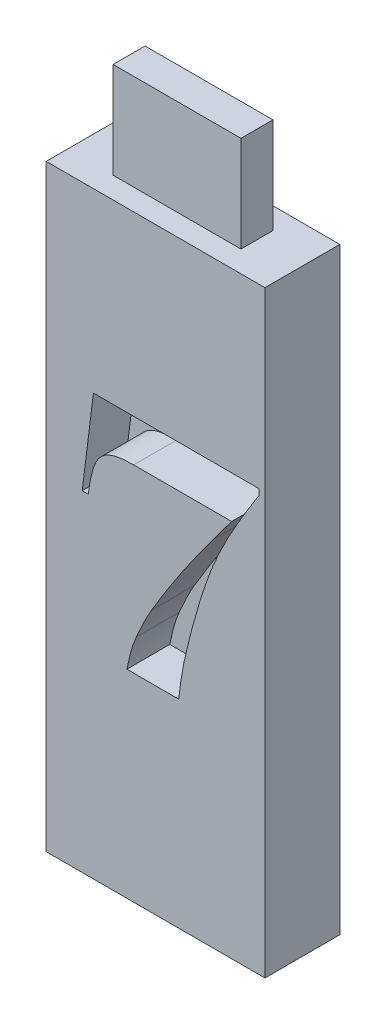
ISO-10303-21;
HEADER;
FILE_DESCRIPTION(('STEP AP214'),'2;1');
FILE_NAME('part.step','',(''),(''),'','','');
FILE_SCHEMA(('AUTOMOTIVE_DESIGN { 1 0 10303 214 1 1 1 1 }'));
ENDSEC;
DATA;
#1=APPLICATION_CONTEXT('core data for automotive mechanical design processes');
#2=APPLICATION_PROTOCOL_DEFINITION('international standard','automotive_design',2000,#1);
#3=PRODUCT_CONTEXT('',#1,'mechanical');
#4=PRODUCT('Part','Part','',(#3));
#5=PRODUCT_RELATED_PRODUCT_CATEGORY('part','',(#4));
#6=PRODUCT_DEFINITION_FORMATION('','',#4);
#7=PRODUCT_DEFINITION_CONTEXT('part definition',#1,'design');
#8=PRODUCT_DEFINITION('design','',#6,#7);
#9=PRODUCT_DEFINITION_SHAPE('','',#8);
#10=(LENGTH_UNIT() NAMED_UNIT(*) SI_UNIT(.MILLI.,.METRE.));
#11=(NAMED_UNIT(*) PLANE_ANGLE_UNIT() SI_UNIT($,.RADIAN.));
#12=(NAMED_UNIT(*) SI_UNIT($,.STERADIAN.) SOLID_ANGLE_UNIT());
#13=UNCERTAINTY_MEASURE_WITH_UNIT(LENGTH_MEASURE(1.E-05),#10,'distance_accuracy_value','');
#14=(GEOMETRIC_REPRESENTATION_CONTEXT(3) GLOBAL_UNCERTAINTY_ASSIGNED_CONTEXT((#13)) GLOBAL_UNIT_ASSIGNED_CONTEXT((#10,
#11,#12)) REPRESENTATION_CONTEXT('',''));
#15=CARTESIAN_POINT('',(0.,0.,0.));
#16=DIRECTION('',(0.,0.,1.));
#17=DIRECTION('',(1.,0.,0.));
#18=AXIS2_PLACEMENT_3D('',#15,#16,#17);
#19=CARTESIAN_POINT('',(-8.69,23.749,5.95));
#20=DIRECTION('',(0.,-1.,0.));
#21=DIRECTION('',(0.,0.,-1.));
#22=AXIS2_PLACEMENT_3D('',#19,#20,#21);
#23=PLANE('',#22);
#24=DIRECTION('',(-1.,0.,0.));
#25=VECTOR('',#24,1.);
#26=CARTESIAN_POINT('',(-8.69,23.749,0.));
#27=LINE('',#26,#25);
#28=CARTESIAN_POINT('',(8.69,23.749,0.));
#29=VERTEX_POINT('',#28);
#30=CARTESIAN_POINT('',(-8.69,23.749,0.));
#31=VERTEX_POINT('',#30);
#32=EDGE_CURVE('E294',#29,#31,#27,.T.);
#33=ORIENTED_EDGE('',*,*,#32,.T.);
#34=DIRECTION('',(0.,0.,-1.));
#35=VECTOR('',#34,1.);
#36=CARTESIAN_POINT('',(-8.69,23.749,5.95));
#37=LINE('',#36,#35);
#38=CARTESIAN_POINT('',(-8.69,23.749,5.95));
#39=VERTEX_POINT('',#38);
#40=EDGE_CURVE('E48',#39,#31,#37,.T.);
#41=ORIENTED_EDGE('',*,*,#40,.F.);
#42=DIRECTION('',(-1.,0.,0.));
#43=VECTOR('',#42,1.);
#44=CARTESIAN_POINT('',(-8.69,23.749,5.95));
#45=LINE('',#44,#43);
#46=CARTESIAN_POINT('',(8.69,23.749,5.95));
#47=VERTEX_POINT('',#46);
#48=EDGE_CURVE('E332',#47,#39,#45,.T.);
#49=ORIENTED_EDGE('',*,*,#48,.F.);
#50=DIRECTION('',(0.,0.,-1.));
#51=VECTOR('',#50,1.);
#52=CARTESIAN_POINT('',(8.69,23.749,5.95));
#53=LINE('',#52,#51);
#54=EDGE_CURVE('E11',#47,#29,#53,.T.);
#55=ORIENTED_EDGE('',*,*,#54,.T.);
#56=EDGE_LOOP('',(#33,#41,#49,#55));
#57=FACE_BOUND('',#56,.T.);
#58=DIRECTION('',(0.,0.,-1.));
#59=VECTOR('',#58,1.);
#60=CARTESIAN_POINT('',(5.08,23.749,4.245));
#61=LINE('',#60,#59);
#62=CARTESIAN_POINT('',(5.08,23.749,4.245));
#63=VERTEX_POINT('',#62);
#64=CARTESIAN_POINT('',(5.08,23.749,1.705));
#65=VERTEX_POINT('',#64);
#66=EDGE_CURVE('E55',#63,#65,#61,.T.);
#67=ORIENTED_EDGE('',*,*,#66,.F.);
#68=DIRECTION('',(1.,0.,0.));
#69=VECTOR('',#68,1.);
#70=CARTESIAN_POINT('',(-5.08,23.749,4.245));
#71=LINE('',#70,#69);
#72=CARTESIAN_POINT('',(-5.08,23.749,4.245));
#73=VERTEX_POINT('',#72);
#74=EDGE_CURVE('E59',#73,#63,#71,.T.);
#75=ORIENTED_EDGE('',*,*,#74,.F.);
#76=DIRECTION('',(0.,0.,1.));
#77=VECTOR('',#76,1.);
#78=CARTESIAN_POINT('',(-5.08,23.749,4.245));
#79=LINE('',#78,#77);
#80=CARTESIAN_POINT('',(-5.08,23.749,1.705));
#81=VERTEX_POINT('',#80);
#82=EDGE_CURVE('E812',#81,#73,#79,.T.);
#83=ORIENTED_EDGE('',*,*,#82,.F.);
#84=DIRECTION('',(-1.,0.,0.));
#85=VECTOR('',#84,1.);
#86=CARTESIAN_POINT('',(-5.08,23.749,1.705));
#87=LINE('',#86,#85);
#88=EDGE_CURVE('E822',#65,#81,#87,.T.);
#89=ORIENTED_EDGE('',*,*,#88,.F.);
#90=EDGE_LOOP('',(#67,#75,#83,#89));
#91=FACE_BOUND('',#90,.T.);
#92=ADVANCED_FACE('F39',(#57,#91),#23,.F.);
#93=CARTESIAN_POINT('',(0.,0.,5.95));
#94=DIRECTION('',(0.,0.,-1.));
#95=DIRECTION('',(-1.,0.,0.));
#96=AXIS2_PLACEMENT_3D('',#93,#94,#95);
#97=PLANE('',#96);
#98=DIRECTION('',(0.,1.,0.));
#99=VECTOR('',#98,1.);
#100=CARTESIAN_POINT('',(8.69,-23.749,5.95));
#101=LINE('',#100,#99);
#102=CARTESIAN_POINT('',(8.69,-23.749,5.95));
#103=VERTEX_POINT('',#102);
#104=EDGE_CURVE('E315',#103,#47,#101,.T.);
#105=ORIENTED_EDGE('',*,*,#104,.T.);
#106=ORIENTED_EDGE('',*,*,#48,.T.);
#107=DIRECTION('',(0.,-1.,0.));
#108=VECTOR('',#107,1.);
#109=CARTESIAN_POINT('',(-8.69,-23.749,5.95));
#110=LINE('',#109,#108);
#111=CARTESIAN_POINT('',(-8.69,-23.749,5.95));
#112=VERTEX_POINT('',#111);
#113=EDGE_CURVE('E307',#39,#112,#110,.T.);
#114=ORIENTED_EDGE('',*,*,#113,.T.);
#115=DIRECTION('',(1.,0.,0.));
#116=VECTOR('',#115,1.);
#117=CARTESIAN_POINT('',(-8.69,-23.749,5.95));
#118=LINE('',#117,#116);
#119=EDGE_CURVE('E323',#112,#103,#118,.T.);
#120=ORIENTED_EDGE('',*,*,#119,.T.);
#121=EDGE_LOOP('',(#105,#106,#114,#120));
#122=FACE_BOUND('',#121,.T.);
#123=DIRECTION('',(1.,0.,0.));
#124=VECTOR('',#123,1.);
#125=CARTESIAN_POINT('',(-4.93529895129443,9.68562623875982,5.95));
#126=LINE('',#125,#124);
#127=CARTESIAN_POINT('',(-4.93529895129443,9.68562623875982,5.95));
#128=VERTEX_POINT('',#127);
#129=CARTESIAN_POINT('',(8.21521828041482,9.68562623875982,5.95));
#130=VERTEX_POINT('',#129);
#131=EDGE_CURVE('E218',#128,#130,#126,.T.);
#132=ORIENTED_EDGE('',*,*,#131,.T.);
#133=DIRECTION('',(0.,-1.,0.));
#134=VECTOR('',#133,1.);
#135=CARTESIAN_POINT('',(8.21521828041482,9.68562623875982,5.95));
#136=LINE('',#135,#134);
#137=CARTESIAN_POINT('',(8.21521828041482,9.21170010697007,5.95));
#138=VERTEX_POINT('',#137);
#139=EDGE_CURVE('E223',#130,#138,#136,.T.);
#140=ORIENTED_EDGE('',*,*,#139,.T.);
#141=DIRECTION('',(-0.539366016611916,-0.842071434098198,0.));
#142=VECTOR('',#141,1.);
#143=CARTESIAN_POINT('',(8.21521828041482,9.21170010697007,5.95));
#144=LINE('',#143,#142);
#145=CARTESIAN_POINT('',(7.84951150155344,8.64074972772731,5.95));
#146=VERTEX_POINT('',#145);
#147=EDGE_CURVE('E603',#138,#146,#144,.T.);
#148=ORIENTED_EDGE('',*,*,#147,.T.);
#149=CARTESIAN_POINT('',(7.84951150155344,8.64074972772731,5.95));
#150=CARTESIAN_POINT('',(7.65962831842579,8.33400221750611,5.95));
#151=CARTESIAN_POINT('',(7.2950320492832,7.74501378812928,5.95));
#152=CARTESIAN_POINT('',(6.78287221592599,6.88889345962347,5.95));
#153=CARTESIAN_POINT('',(6.32474967035971,6.09843468753544,5.95));
#154=CARTESIAN_POINT('',(5.78533257943877,5.14589757685714,5.95));
#155=CARTESIAN_POINT('',(5.20192430658441,4.00554401828371,5.95));
#156=CARTESIAN_POINT('',(4.68967882120613,2.86496624863259,5.95));
#157=CARTESIAN_POINT('',(4.32310308233498,1.94112166536612,5.95));
#158=CARTESIAN_POINT('',(4.06048702715044,1.21523233586431,5.95));
#159=CARTESIAN_POINT('',(3.79297561962232,0.453893083594508,5.95));
#160=CARTESIAN_POINT('',(3.62520083883235,-0.0698614357343857,5.95));
#161=CARTESIAN_POINT('',(3.53939589354431,-0.337724863502106,5.95));
#162=B_SPLINE_CURVE_WITH_KNOTS('',3,(#149,#150,#151,#152,#153,#154,#155,#156,#157,#158,#159,
#160,#161),.UNSPECIFIED.,.F.,.F.,(4,1,1,1,1,1,1,1,1,1,4),(0.,0.108303983698061,
0.207955374136771,0.299483070178648,0.382580967061052,0.536566343346188,0.683834004631161,
0.757755849232183,0.834901209469876,0.915563634642486,1.),.UNSPECIFIED.);
#163=CARTESIAN_POINT('',(3.53939589354431,-0.337724863502106,5.95));
#164=VERTEX_POINT('',#163);
#165=EDGE_CURVE('E607',#146,#164,#162,.T.);
#166=ORIENTED_EDGE('',*,*,#165,.T.);
#167=CARTESIAN_POINT('',(3.53939589354431,-0.337724863502106,5.95));
#168=CARTESIAN_POINT('',(3.29451848604547,-1.17513929718666,5.95));
#169=CARTESIAN_POINT('',(2.8073114792853,-2.84125535019642,5.95));
#170=CARTESIAN_POINT('',(2.42147696528856,-4.53371686358404,5.95));
#171=CARTESIAN_POINT('',(2.22956855292854,-5.37552232740888,5.95));
#172=B_SPLINE_CURVE_WITH_KNOTS('',3,(#167,#168,#169,#170,#171),.UNSPECIFIED.,.F.,.F.,(4,1,4),
(0.,0.502614708124207,1.),.UNSPECIFIED.);
#173=CARTESIAN_POINT('',(2.22956855292854,-5.37552232740888,5.95));
#174=VERTEX_POINT('',#173);
#175=EDGE_CURVE('E613',#164,#174,#172,.T.);
#176=ORIENTED_EDGE('',*,*,#175,.T.);
#177=CARTESIAN_POINT('',(2.22956855292854,-5.37552232740888,5.95));
#178=CARTESIAN_POINT('',(2.14861537048876,-5.8188434981745,5.95));
#179=CARTESIAN_POINT('',(1.99039466586074,-6.6853021833191,5.95));
#180=CARTESIAN_POINT('',(1.89033565836744,-7.56037120752632,5.95));
#181=CARTESIAN_POINT('',(1.84147156311647,-7.98771360499018,5.95));
#182=B_SPLINE_CURVE_WITH_KNOTS('',3,(#177,#178,#179,#180,#181),.UNSPECIFIED.,.F.,.F.,(4,1,4),
(0.,0.511647212228745,1.),.UNSPECIFIED.);
#183=CARTESIAN_POINT('',(1.84147156311647,-7.98771360499018,5.95));
#184=VERTEX_POINT('',#183);
#185=EDGE_CURVE('E622',#174,#184,#182,.T.);
#186=ORIENTED_EDGE('',*,*,#185,.T.);
#187=DIRECTION('',(-1.,0.,0.));
#188=VECTOR('',#187,1.);
#189=CARTESIAN_POINT('',(1.84147156311647,-7.98771360499018,5.95));
#190=LINE('',#189,#188);
#191=CARTESIAN_POINT('',(-2.27832725181174,-7.98771360499018,5.95));
#192=VERTEX_POINT('',#191);
#193=EDGE_CURVE('E631',#184,#192,#190,.T.);
#194=ORIENTED_EDGE('',*,*,#193,.T.);
#195=CARTESIAN_POINT('',(-2.27832725181174,-7.98771360499018,5.95));
#196=CARTESIAN_POINT('',(-2.22842602726121,-7.74212395858024,5.95));
#197=CARTESIAN_POINT('',(-2.13219713266742,-7.26853196939416,5.95));
#198=CARTESIAN_POINT('',(-1.9553357352871,-6.59273748393541,5.95));
#199=CARTESIAN_POINT('',(-1.76630358340422,-5.97361971169886,5.95));
#200=CARTESIAN_POINT('',(-1.61053550972079,-5.58975155294265,5.95));
#201=CARTESIAN_POINT('',(-1.53571858861363,-5.40537594200981,5.95));
#202=B_SPLINE_CURVE_WITH_KNOTS('',3,(#195,#196,#197,#198,#199,#200,#201),.UNSPECIFIED.,.F.,.F.,
(4,1,1,1,4),(0.,0.279248072754579,0.538498475751985,0.778336328401477,1.),.UNSPECIFIED.);
#203=CARTESIAN_POINT('',(-1.53571858861363,-5.40537594200981,5.95));
#204=VERTEX_POINT('',#203);
#205=EDGE_CURVE('E638',#192,#204,#202,.T.);
#206=ORIENTED_EDGE('',*,*,#205,.T.);
#207=CARTESIAN_POINT('',(-1.53571858861363,-5.40537594200981,5.95));
#208=CARTESIAN_POINT('',(-1.43247037911013,-5.17095585527889,5.95));
#209=CARTESIAN_POINT('',(-1.23367875374486,-4.71960904467946,5.95));
#210=CARTESIAN_POINT('',(-0.927100645313659,-4.07776422466053,5.95));
#211=CARTESIAN_POINT('',(-0.630798745820817,-3.49403020881497,5.95));
#212=CARTESIAN_POINT('',(-0.424952864373795,-3.13083189696854,5.95));
#213=CARTESIAN_POINT('',(-0.326647197276006,-2.95737954473363,5.95));
#214=B_SPLINE_CURVE_WITH_KNOTS('',3,(#207,#208,#209,#210,#211,#212,#213),.UNSPECIFIED.,.F.,.F.,
(4,1,1,1,4),(0.,0.281286642357857,0.541582552344031,0.781073914696299,1.),.UNSPECIFIED.);
#215=CARTESIAN_POINT('',(-0.326647197276006,-2.95737954473363,5.95));
#216=VERTEX_POINT('',#215);
#217=EDGE_CURVE('E644',#204,#216,#214,.T.);
#218=ORIENTED_EDGE('',*,*,#217,.T.);
#219=CARTESIAN_POINT('',(-0.326647197276006,-2.95737954473363,5.95));
#220=CARTESIAN_POINT('',(-0.160956821329831,-2.67690253545555,5.95));
#221=CARTESIAN_POINT('',(0.175753632139588,-2.10692651577142,5.95));
#222=CARTESIAN_POINT('',(0.708141987023246,-1.24878434887096,5.95));
#223=CARTESIAN_POINT('',(1.26621759889911,-0.367355884859119,5.95));
#224=CARTESIAN_POINT('',(1.86140603954731,0.532183686932351,5.95));
#225=CARTESIAN_POINT('',(2.48731836673337,1.45262748764341,5.95));
#226=CARTESIAN_POINT('',(3.14585582164714,2.39310678834193,5.95));
#227=CARTESIAN_POINT('',(3.83052528378173,3.35704959314023,5.95));
#228=CARTESIAN_POINT('',(4.30584759349214,4.00050759846938,5.95));
#229=CARTESIAN_POINT('',(4.54695538632566,4.32690241789306,5.95));
#230=B_SPLINE_CURVE_WITH_KNOTS('',3,(#219,#220,#221,#222,#223,#224,#225,#226,#227,#228,#229),
.UNSPECIFIED.,.F.,.F.,(4,1,1,1,1,1,1,1,4),(0.,0.111450171902987,0.226485320625321,
0.345491936328139,0.468366757494292,0.595494865335301,0.726307224551297,0.861169022251187,1.),.UNSPECIFIED.);
#231=CARTESIAN_POINT('',(4.54695538632566,4.32690241789306,5.95));
#232=VERTEX_POINT('',#231);
#233=EDGE_CURVE('E653',#216,#232,#230,.T.);
#234=ORIENTED_EDGE('',*,*,#233,.T.);
#235=DIRECTION('',(0.597144155348655,0.802133940020581,0.));
#236=VECTOR('',#235,1.);
#237=CARTESIAN_POINT('',(4.54695538632566,4.32690241789306,5.95));
#238=LINE('',#237,#236);
#239=CARTESIAN_POINT('',(6.04709952002235,6.34202140345577,5.95));
#240=VERTEX_POINT('',#239);
#241=EDGE_CURVE('E662',#232,#240,#238,.T.);
#242=ORIENTED_EDGE('',*,*,#241,.T.);
#243=DIRECTION('',(-1.,0.,0.));
#244=VECTOR('',#243,1.);
#245=CARTESIAN_POINT('',(6.04709952002235,6.34202140345577,5.95));
#246=LINE('',#245,#244);
#247=CARTESIAN_POINT('',(-1.7372304871699,6.34202140345577,5.95));
#248=VERTEX_POINT('',#247);
#249=EDGE_CURVE('E669',#240,#248,#246,.T.);
#250=ORIENTED_EDGE('',*,*,#249,.T.);
#251=CARTESIAN_POINT('',(-1.7372304871699,6.34202140345577,5.95));
#252=CARTESIAN_POINT('',(-1.94140739209922,6.3392870903844,5.95));
#253=CARTESIAN_POINT('',(-2.32464432152111,6.33415482654726,5.95));
#254=CARTESIAN_POINT('',(-2.86315809821053,6.27489297244371,5.95));
#255=CARTESIAN_POINT('',(-3.32896764094686,6.17837953213881,5.95));
#256=CARTESIAN_POINT('',(-3.72702514577543,6.0357335644001,5.95));
#257=CARTESIAN_POINT('',(-4.07060604547399,5.84627462081815,5.95));
#258=CARTESIAN_POINT('',(-4.35642797739027,5.58867170555389,5.95));
#259=CARTESIAN_POINT('',(-4.60409945993286,5.27679852270177,5.95));
#260=CARTESIAN_POINT('',(-4.80669203602683,4.89667093687658,5.95));
#261=CARTESIAN_POINT('',(-4.97489526941914,4.43751614243278,5.95));
#262=CARTESIAN_POINT('',(-5.11972113781896,3.88849231305421,5.95));
#263=CARTESIAN_POINT('',(-5.25029320202415,3.23922430137457,5.95));
#264=CARTESIAN_POINT('',(-5.31492688948754,2.7712248876142,5.95));
#265=CARTESIAN_POINT('',(-5.34951785388232,2.52075873453685,5.95));
#266=B_SPLINE_CURVE_WITH_KNOTS('',3,(#251,#252,#253,#254,#255,#256,#257,#258,#259,#260,#261,
#262,#263,#264,#265),.UNSPECIFIED.,.F.,.F.,(4,1,1,1,1,1,1,1,1,1,1,1,4),(0.,0.100980182684626,
0.18953825927529,0.267641835985537,0.335787117992349,0.398078123725719,0.460432944443767,
0.524831746085989,0.594235489203616,0.672535230304427,0.76629548367835,0.874924904949008,1.),.UNSPECIFIED.);
#267=CARTESIAN_POINT('',(-5.34951785388232,2.52075873453685,5.95));
#268=VERTEX_POINT('',#267);
#269=EDGE_CURVE('E673',#248,#268,#266,.T.);
#270=ORIENTED_EDGE('',*,*,#269,.T.);
#271=DIRECTION('',(-1.,0.,0.));
#272=VECTOR('',#271,1.);
#273=CARTESIAN_POINT('',(-5.34951785388232,2.52075873453685,5.95));
#274=LINE('',#273,#272);
#275=CARTESIAN_POINT('',(-5.82717568749718,2.52075873453685,5.95));
#276=VERTEX_POINT('',#275);
#277=EDGE_CURVE('E679',#268,#276,#274,.T.);
#278=ORIENTED_EDGE('',*,*,#277,.T.);
#279=DIRECTION('',(0.123525825273468,0.992341357845428,0.));
#280=VECTOR('',#279,1.);
#281=CARTESIAN_POINT('',(-5.82717568749718,2.52075873453685,5.95));
#282=LINE('',#281,#280);
#283=EDGE_CURVE('E234',#276,#128,#282,.T.);
#284=ORIENTED_EDGE('',*,*,#283,.T.);
#285=EDGE_LOOP('',(#132,#140,#148,#166,#176,#186,#194,#206,#218,#234,#242,#250,#270,#278,#284));
#286=FACE_BOUND('',#285,.T.);
#287=ADVANCED_FACE('F275',(#122,#286),#97,.F.);
#288=CARTESIAN_POINT('',(8.69,-23.749,5.95));
#289=DIRECTION('',(-1.,0.,0.));
#290=DIRECTION('',(0.,0.,1.));
#291=AXIS2_PLACEMENT_3D('',#288,#289,#290);
#292=PLANE('',#291);
#293=DIRECTION('',(0.,1.,0.));
#294=VECTOR('',#293,1.);
#295=CARTESIAN_POINT('',(8.69,-23.749,0.));
#296=LINE('',#295,#294);
#297=CARTESIAN_POINT('',(8.69,-23.749,0.));
#298=VERTEX_POINT('',#297);
#299=EDGE_CURVE('E303',#298,#29,#296,.T.);
#300=ORIENTED_EDGE('',*,*,#299,.T.);
#301=ORIENTED_EDGE('',*,*,#54,.F.);
#302=ORIENTED_EDGE('',*,*,#104,.F.);
#303=DIRECTION('',(0.,0.,-1.));
#304=VECTOR('',#303,1.);
#305=CARTESIAN_POINT('',(8.69,-23.749,5.95));
#306=LINE('',#305,#304);
#307=EDGE_CURVE('E319',#103,#298,#306,.T.);
#308=ORIENTED_EDGE('',*,*,#307,.T.);
#309=EDGE_LOOP('',(#300,#301,#302,#308));
#310=FACE_BOUND('',#309,.T.);
#311=ADVANCED_FACE('F41',(#310),#292,.F.);
#312=CARTESIAN_POINT('',(-8.69,-23.749,5.95));
#313=DIRECTION('',(1.,0.,0.));
#314=DIRECTION('',(0.,0.,-1.));
#315=AXIS2_PLACEMENT_3D('',#312,#313,#314);
#316=PLANE('',#315);
#317=DIRECTION('',(0.,-1.,0.));
#318=VECTOR('',#317,1.);
#319=CARTESIAN_POINT('',(-8.69,-23.749,0.));
#320=LINE('',#319,#318);
#321=CARTESIAN_POINT('',(-8.69,-23.749,0.));
#322=VERTEX_POINT('',#321);
#323=EDGE_CURVE('E302',#31,#322,#320,.T.);
#324=ORIENTED_EDGE('',*,*,#323,.T.);
#325=DIRECTION('',(0.,0.,-1.));
#326=VECTOR('',#325,1.);
#327=CARTESIAN_POINT('',(-8.69,-23.749,5.95));
#328=LINE('',#327,#326);
#329=EDGE_CURVE('E309',#112,#322,#328,.T.);
#330=ORIENTED_EDGE('',*,*,#329,.F.);
#331=ORIENTED_EDGE('',*,*,#113,.F.);
#332=ORIENTED_EDGE('',*,*,#40,.T.);
#333=EDGE_LOOP('',(#324,#330,#331,#332));
#334=FACE_BOUND('',#333,.T.);
#335=ADVANCED_FACE('F285',(#334),#316,.F.);
#336=CARTESIAN_POINT('',(-8.69,-23.749,5.95));
#337=DIRECTION('',(0.,1.,0.));
#338=DIRECTION('',(0.,0.,1.));
#339=AXIS2_PLACEMENT_3D('',#336,#337,#338);
#340=PLANE('',#339);
#341=DIRECTION('',(1.,0.,0.));
#342=VECTOR('',#341,1.);
#343=CARTESIAN_POINT('',(-8.69,-23.749,0.));
#344=LINE('',#343,#342);
#345=EDGE_CURVE('E311',#322,#298,#344,.T.);
#346=ORIENTED_EDGE('',*,*,#345,.T.);
#347=ORIENTED_EDGE('',*,*,#307,.F.);
#348=ORIENTED_EDGE('',*,*,#119,.F.);
#349=ORIENTED_EDGE('',*,*,#329,.T.);
#350=EDGE_LOOP('',(#346,#347,#348,#349));
#351=FACE_BOUND('',#350,.T.);
#352=ADVANCED_FACE('F281',(#351),#340,.F.);
#353=CARTESIAN_POINT('',(0.,0.,0.));
#354=DIRECTION('',(0.,0.,-1.));
#355=DIRECTION('',(-1.,0.,0.));
#356=AXIS2_PLACEMENT_3D('',#353,#354,#355);
#357=PLANE('',#356);
#358=ORIENTED_EDGE('',*,*,#299,.F.);
#359=ORIENTED_EDGE('',*,*,#345,.F.);
#360=ORIENTED_EDGE('',*,*,#323,.F.);
#361=ORIENTED_EDGE('',*,*,#32,.F.);
#362=EDGE_LOOP('',(#358,#359,#360,#361));
#363=FACE_BOUND('',#362,.T.);
#364=ADVANCED_FACE('F273',(#363),#357,.T.);
#365=CARTESIAN_POINT('',(-4.93529895129443,9.68562623875982,2.54));
#366=DIRECTION('',(0.,-1.,0.));
#367=DIRECTION('',(0.,0.,-1.));
#368=AXIS2_PLACEMENT_3D('',#365,#366,#367);
#369=PLANE('',#368);
#370=ORIENTED_EDGE('',*,*,#131,.F.);
#371=DIRECTION('',(0.,0.,1.));
#372=VECTOR('',#371,1.);
#373=CARTESIAN_POINT('',(-4.93529895129443,9.68562623875982,2.54));
#374=LINE('',#373,#372);
#375=CARTESIAN_POINT('',(-4.93529895129443,9.68562623875982,2.54));
#376=VERTEX_POINT('',#375);
#377=EDGE_CURVE('E598',#376,#128,#374,.T.);
#378=ORIENTED_EDGE('',*,*,#377,.F.);
#379=DIRECTION('',(1.,0.,0.));
#380=VECTOR('',#379,1.);
#381=CARTESIAN_POINT('',(-4.93529895129443,9.68562623875982,2.54));
#382=LINE('',#381,#380);
#383=CARTESIAN_POINT('',(8.21521828041482,9.68562623875982,2.54));
#384=VERTEX_POINT('',#383);
#385=EDGE_CURVE('E229',#376,#384,#382,.T.);
#386=ORIENTED_EDGE('',*,*,#385,.T.);
#387=DIRECTION('',(0.,0.,1.));
#388=VECTOR('',#387,1.);
#389=CARTESIAN_POINT('',(8.21521828041482,9.68562623875982,2.54));
#390=LINE('',#389,#388);
#391=EDGE_CURVE('E336',#384,#130,#390,.T.);
#392=ORIENTED_EDGE('',*,*,#391,.T.);
#393=EDGE_LOOP('',(#370,#378,#386,#392));
#394=FACE_BOUND('',#393,.T.);
#395=ADVANCED_FACE('F269',(#394),#369,.T.);
#396=CARTESIAN_POINT('',(8.21521828041482,9.68562623875982,2.54));
#397=DIRECTION('',(-1.,0.,0.));
#398=DIRECTION('',(0.,0.,1.));
#399=AXIS2_PLACEMENT_3D('',#396,#397,#398);
#400=PLANE('',#399);
#401=ORIENTED_EDGE('',*,*,#139,.F.);
#402=ORIENTED_EDGE('',*,*,#391,.F.);
#403=DIRECTION('',(0.,-1.,0.));
#404=VECTOR('',#403,1.);
#405=CARTESIAN_POINT('',(8.21521828041482,9.68562623875982,2.54));
#406=LINE('',#405,#404);
#407=CARTESIAN_POINT('',(8.21521828041482,9.21170010697007,2.54));
#408=VERTEX_POINT('',#407);
#409=EDGE_CURVE('E233',#384,#408,#406,.T.);
#410=ORIENTED_EDGE('',*,*,#409,.T.);
#411=DIRECTION('',(0.,0.,1.));
#412=VECTOR('',#411,1.);
#413=CARTESIAN_POINT('',(8.21521828041482,9.21170010697007,2.54));
#414=LINE('',#413,#412);
#415=EDGE_CURVE('E340',#408,#138,#414,.T.);
#416=ORIENTED_EDGE('',*,*,#415,.T.);
#417=EDGE_LOOP('',(#401,#402,#410,#416));
#418=FACE_BOUND('',#417,.T.);
#419=ADVANCED_FACE('F265',(#418),#400,.T.);
#420=CARTESIAN_POINT('',(8.21521828041482,9.21170010697007,2.54));
#421=DIRECTION('',(-0.842071434098197,0.539366016611916,0.));
#422=DIRECTION('',(-0.539366016611916,-0.842071434098198,0.));
#423=AXIS2_PLACEMENT_3D('',#420,#421,#422);
#424=PLANE('',#423);
#425=ORIENTED_EDGE('',*,*,#147,.F.);
#426=ORIENTED_EDGE('',*,*,#415,.F.);
#427=DIRECTION('',(-0.539366016611916,-0.842071434098198,0.));
#428=VECTOR('',#427,1.);
#429=CARTESIAN_POINT('',(8.21521828041482,9.21170010697007,2.54));
#430=LINE('',#429,#428);
#431=CARTESIAN_POINT('',(7.84951150155344,8.64074972772731,2.54));
#432=VERTEX_POINT('',#431);
#433=EDGE_CURVE('E237',#408,#432,#430,.T.);
#434=ORIENTED_EDGE('',*,*,#433,.T.);
#435=DIRECTION('',(0.,0.,1.));
#436=VECTOR('',#435,1.);
#437=CARTESIAN_POINT('',(7.84951150155344,8.64074972772731,2.54));
#438=LINE('',#437,#436);
#439=EDGE_CURVE('E344',#432,#146,#438,.T.);
#440=ORIENTED_EDGE('',*,*,#439,.T.);
#441=EDGE_LOOP('',(#425,#426,#434,#440));
#442=FACE_BOUND('',#441,.T.);
#443=ADVANCED_FACE('F260',(#442),#424,.T.);
#444=CARTESIAN_POINT('',(7.84951150155344,8.64074972772731,2.54));
#445=CARTESIAN_POINT('',(7.65962831842579,8.33400221750611,2.54));
#446=CARTESIAN_POINT('',(7.2950320492832,7.74501378812928,2.54));
#447=CARTESIAN_POINT('',(6.78287221592599,6.88889345962347,2.54));
#448=CARTESIAN_POINT('',(6.32474967035971,6.09843468753544,2.54));
#449=CARTESIAN_POINT('',(5.78533257943877,5.14589757685714,2.54));
#450=CARTESIAN_POINT('',(5.20192430658441,4.00554401828371,2.54));
#451=CARTESIAN_POINT('',(4.68967882120613,2.86496624863259,2.54));
#452=CARTESIAN_POINT('',(4.32310308233498,1.94112166536612,2.54));
#453=CARTESIAN_POINT('',(4.06048702715044,1.21523233586431,2.54));
#454=CARTESIAN_POINT('',(3.79297561962232,0.453893083594508,2.54));
#455=CARTESIAN_POINT('',(3.62520083883235,-0.0698614357343857,2.54));
#456=CARTESIAN_POINT('',(3.53939589354431,-0.337724863502106,2.54));
#457=B_SPLINE_CURVE_WITH_KNOTS('',3,(#444,#445,#446,#447,#448,#449,#450,#451,#452,#453,#454,
#455,#456),.UNSPECIFIED.,.F.,.F.,(4,1,1,1,1,1,1,1,1,1,4),(0.,0.108303983698061,
0.207955374136771,0.299483070178648,0.382580967061052,0.536566343346188,0.683834004631161,
0.757755849232183,0.834901209469876,0.915563634642486,1.),.UNSPECIFIED.);
#458=DIRECTION('',(0.,0.,1.));
#459=VECTOR('',#458,1.);
#460=SURFACE_OF_LINEAR_EXTRUSION('',#457,#459);
#461=ORIENTED_EDGE('',*,*,#165,.F.);
#462=ORIENTED_EDGE('',*,*,#439,.F.);
#463=CARTESIAN_POINT('',(3.53939589354431,-0.337724863502106,2.54));
#464=VERTEX_POINT('',#463);
#465=EDGE_CURVE('E240',#432,#464,#457,.T.);
#466=ORIENTED_EDGE('',*,*,#465,.T.);
#467=DIRECTION('',(0.,0.,1.));
#468=VECTOR('',#467,1.);
#469=CARTESIAN_POINT('',(3.53939589354431,-0.337724863502106,2.54));
#470=LINE('',#469,#468);
#471=EDGE_CURVE('E722',#464,#164,#470,.T.);
#472=ORIENTED_EDGE('',*,*,#471,.T.);
#473=EDGE_LOOP('',(#461,#462,#466,#472));
#474=FACE_BOUND('',#473,.T.);
#475=ADVANCED_FACE('F255',(#474),#460,.T.);
#476=CARTESIAN_POINT('',(3.53939589354431,-0.337724863502106,2.54));
#477=CARTESIAN_POINT('',(3.29451848604547,-1.17513929718666,2.54));
#478=CARTESIAN_POINT('',(2.8073114792853,-2.84125535019642,2.54));
#479=CARTESIAN_POINT('',(2.42147696528856,-4.53371686358404,2.54));
#480=CARTESIAN_POINT('',(2.22956855292854,-5.37552232740888,2.54));
#481=B_SPLINE_CURVE_WITH_KNOTS('',3,(#476,#477,#478,#479,#480),.UNSPECIFIED.,.F.,.F.,(4,1,4),
(0.,0.502614708124207,1.),.UNSPECIFIED.);
#482=DIRECTION('',(0.,0.,1.));
#483=VECTOR('',#482,1.);
#484=SURFACE_OF_LINEAR_EXTRUSION('',#481,#483);
#485=ORIENTED_EDGE('',*,*,#175,.F.);
#486=ORIENTED_EDGE('',*,*,#471,.F.);
#487=CARTESIAN_POINT('',(2.22956855292854,-5.37552232740888,2.54));
#488=VERTEX_POINT('',#487);
#489=EDGE_CURVE('E246',#464,#488,#481,.T.);
#490=ORIENTED_EDGE('',*,*,#489,.T.);
#491=DIRECTION('',(0.,0.,1.));
#492=VECTOR('',#491,1.);
#493=CARTESIAN_POINT('',(2.22956855292854,-5.37552232740888,2.54));
#494=LINE('',#493,#492);
#495=EDGE_CURVE('E719',#488,#174,#494,.T.);
#496=ORIENTED_EDGE('',*,*,#495,.T.);
#497=EDGE_LOOP('',(#485,#486,#490,#496));
#498=FACE_BOUND('',#497,.T.);
#499=ADVANCED_FACE('F259',(#498),#484,.T.);
#500=CARTESIAN_POINT('',(2.22956855292854,-5.37552232740888,2.54));
#501=CARTESIAN_POINT('',(2.14861537048876,-5.8188434981745,2.54));
#502=CARTESIAN_POINT('',(1.99039466586074,-6.6853021833191,2.54));
#503=CARTESIAN_POINT('',(1.89033565836744,-7.56037120752632,2.54));
#504=CARTESIAN_POINT('',(1.84147156311647,-7.98771360499018,2.54));
#505=B_SPLINE_CURVE_WITH_KNOTS('',3,(#500,#501,#502,#503,#504),.UNSPECIFIED.,.F.,.F.,(4,1,4),
(0.,0.511647212228745,1.),.UNSPECIFIED.);
#506=DIRECTION('',(0.,0.,1.));
#507=VECTOR('',#506,1.);
#508=SURFACE_OF_LINEAR_EXTRUSION('',#505,#507);
#509=ORIENTED_EDGE('',*,*,#185,.F.);
#510=ORIENTED_EDGE('',*,*,#495,.F.);
#511=CARTESIAN_POINT('',(1.84147156311647,-7.98771360499018,2.54));
#512=VERTEX_POINT('',#511);
#513=EDGE_CURVE('E740',#488,#512,#505,.T.);
#514=ORIENTED_EDGE('',*,*,#513,.T.);
#515=DIRECTION('',(0.,0.,1.));
#516=VECTOR('',#515,1.);
#517=CARTESIAN_POINT('',(1.84147156311647,-7.98771360499018,2.54));
#518=LINE('',#517,#516);
#519=EDGE_CURVE('E716',#512,#184,#518,.T.);
#520=ORIENTED_EDGE('',*,*,#519,.T.);
#521=EDGE_LOOP('',(#509,#510,#514,#520));
#522=FACE_BOUND('',#521,.T.);
#523=ADVANCED_FACE('F390',(#522),#508,.T.);
#524=CARTESIAN_POINT('',(1.84147156311647,-7.98771360499018,2.54));
#525=DIRECTION('',(0.,1.,0.));
#526=DIRECTION('',(0.,0.,1.));
#527=AXIS2_PLACEMENT_3D('',#524,#525,#526);
#528=PLANE('',#527);
#529=ORIENTED_EDGE('',*,*,#193,.F.);
#530=ORIENTED_EDGE('',*,*,#519,.F.);
#531=DIRECTION('',(-1.,0.,0.));
#532=VECTOR('',#531,1.);
#533=CARTESIAN_POINT('',(1.84147156311647,-7.98771360499018,2.54));
#534=LINE('',#533,#532);
#535=CARTESIAN_POINT('',(-2.27832725181174,-7.98771360499018,2.54));
#536=VERTEX_POINT('',#535);
#537=EDGE_CURVE('E744',#512,#536,#534,.T.);
#538=ORIENTED_EDGE('',*,*,#537,.T.);
#539=DIRECTION('',(0.,0.,1.));
#540=VECTOR('',#539,1.);
#541=CARTESIAN_POINT('',(-2.27832725181174,-7.98771360499018,2.54));
#542=LINE('',#541,#540);
#543=EDGE_CURVE('E713',#536,#192,#542,.T.);
#544=ORIENTED_EDGE('',*,*,#543,.T.);
#545=EDGE_LOOP('',(#529,#530,#538,#544));
#546=FACE_BOUND('',#545,.T.);
#547=ADVANCED_FACE('F397',(#546),#528,.T.);
#548=CARTESIAN_POINT('',(-2.27832725181174,-7.98771360499018,2.54));
#549=CARTESIAN_POINT('',(-2.22842602726121,-7.74212395858024,2.54));
#550=CARTESIAN_POINT('',(-2.13219713266742,-7.26853196939416,2.54));
#551=CARTESIAN_POINT('',(-1.9553357352871,-6.59273748393541,2.54));
#552=CARTESIAN_POINT('',(-1.76630358340422,-5.97361971169886,2.54));
#553=CARTESIAN_POINT('',(-1.61053550972079,-5.58975155294265,2.54));
#554=CARTESIAN_POINT('',(-1.53571858861363,-5.40537594200981,2.54));
#555=B_SPLINE_CURVE_WITH_KNOTS('',3,(#548,#549,#550,#551,#552,#553,#554),.UNSPECIFIED.,.F.,.F.,
(4,1,1,1,4),(0.,0.279248072754579,0.538498475751985,0.778336328401477,1.),.UNSPECIFIED.);
#556=DIRECTION('',(0.,0.,1.));
#557=VECTOR('',#556,1.);
#558=SURFACE_OF_LINEAR_EXTRUSION('',#555,#557);
#559=ORIENTED_EDGE('',*,*,#205,.F.);
#560=ORIENTED_EDGE('',*,*,#543,.F.);
#561=CARTESIAN_POINT('',(-1.53571858861363,-5.40537594200981,2.54));
#562=VERTEX_POINT('',#561);
#563=EDGE_CURVE('E786',#536,#562,#555,.T.);
#564=ORIENTED_EDGE('',*,*,#563,.T.);
#565=DIRECTION('',(0.,0.,1.));
#566=VECTOR('',#565,1.);
#567=CARTESIAN_POINT('',(-1.53571858861363,-5.40537594200981,2.54));
#568=LINE('',#567,#566);
#569=EDGE_CURVE('E710',#562,#204,#568,.T.);
#570=ORIENTED_EDGE('',*,*,#569,.T.);
#571=EDGE_LOOP('',(#559,#560,#564,#570));
#572=FACE_BOUND('',#571,.T.);
#573=ADVANCED_FACE('F404',(#572),#558,.T.);
#574=CARTESIAN_POINT('',(-1.53571858861363,-5.40537594200981,2.54));
#575=CARTESIAN_POINT('',(-1.43247037911013,-5.17095585527889,2.54));
#576=CARTESIAN_POINT('',(-1.23367875374486,-4.71960904467946,2.54));
#577=CARTESIAN_POINT('',(-0.927100645313659,-4.07776422466053,2.54));
#578=CARTESIAN_POINT('',(-0.630798745820817,-3.49403020881497,2.54));
#579=CARTESIAN_POINT('',(-0.424952864373795,-3.13083189696854,2.54));
#580=CARTESIAN_POINT('',(-0.326647197276006,-2.95737954473363,2.54));
#581=B_SPLINE_CURVE_WITH_KNOTS('',3,(#574,#575,#576,#577,#578,#579,#580),.UNSPECIFIED.,.F.,.F.,
(4,1,1,1,4),(0.,0.281286642357857,0.541582552344031,0.781073914696299,1.),.UNSPECIFIED.);
#582=DIRECTION('',(0.,0.,1.));
#583=VECTOR('',#582,1.);
#584=SURFACE_OF_LINEAR_EXTRUSION('',#581,#583);
#585=ORIENTED_EDGE('',*,*,#217,.F.);
#586=ORIENTED_EDGE('',*,*,#569,.F.);
#587=CARTESIAN_POINT('',(-0.326647197276006,-2.95737954473363,2.54));
#588=VERTEX_POINT('',#587);
#589=EDGE_CURVE('E751',#562,#588,#581,.T.);
#590=ORIENTED_EDGE('',*,*,#589,.T.);
#591=DIRECTION('',(0.,0.,1.));
#592=VECTOR('',#591,1.);
#593=CARTESIAN_POINT('',(-0.326647197276006,-2.95737954473363,2.54));
#594=LINE('',#593,#592);
#595=EDGE_CURVE('E707',#588,#216,#594,.T.);
#596=ORIENTED_EDGE('',*,*,#595,.T.);
#597=EDGE_LOOP('',(#585,#586,#590,#596));
#598=FACE_BOUND('',#597,.T.);
#599=ADVANCED_FACE('F412',(#598),#584,.T.);
#600=CARTESIAN_POINT('',(-0.326647197276006,-2.95737954473363,2.54));
#601=CARTESIAN_POINT('',(-0.160956821329831,-2.67690253545555,2.54));
#602=CARTESIAN_POINT('',(0.175753632139588,-2.10692651577142,2.54));
#603=CARTESIAN_POINT('',(0.708141987023246,-1.24878434887096,2.54));
#604=CARTESIAN_POINT('',(1.26621759889911,-0.367355884859119,2.54));
#605=CARTESIAN_POINT('',(1.86140603954731,0.532183686932351,2.54));
#606=CARTESIAN_POINT('',(2.48731836673337,1.45262748764341,2.54));
#607=CARTESIAN_POINT('',(3.14585582164714,2.39310678834193,2.54));
#608=CARTESIAN_POINT('',(3.83052528378173,3.35704959314023,2.54));
#609=CARTESIAN_POINT('',(4.30584759349214,4.00050759846938,2.54));
#610=CARTESIAN_POINT('',(4.54695538632566,4.32690241789306,2.54));
#611=B_SPLINE_CURVE_WITH_KNOTS('',3,(#600,#601,#602,#603,#604,#605,#606,#607,#608,#609,#610),
.UNSPECIFIED.,.F.,.F.,(4,1,1,1,1,1,1,1,4),(0.,0.111450171902987,0.226485320625321,
0.345491936328139,0.468366757494292,0.595494865335301,0.726307224551297,0.861169022251187,1.),.UNSPECIFIED.);
#612=DIRECTION('',(0.,0.,1.));
#613=VECTOR('',#612,1.);
#614=SURFACE_OF_LINEAR_EXTRUSION('',#611,#613);
#615=ORIENTED_EDGE('',*,*,#233,.F.);
#616=ORIENTED_EDGE('',*,*,#595,.F.);
#617=CARTESIAN_POINT('',(4.54695538632566,4.32690241789306,2.54));
#618=VERTEX_POINT('',#617);
#619=EDGE_CURVE('E755',#588,#618,#611,.T.);
#620=ORIENTED_EDGE('',*,*,#619,.T.);
#621=DIRECTION('',(0.,0.,1.));
#622=VECTOR('',#621,1.);
#623=CARTESIAN_POINT('',(4.54695538632566,4.32690241789306,2.54));
#624=LINE('',#623,#622);
#625=EDGE_CURVE('E704',#618,#232,#624,.T.);
#626=ORIENTED_EDGE('',*,*,#625,.T.);
#627=EDGE_LOOP('',(#615,#616,#620,#626));
#628=FACE_BOUND('',#627,.T.);
#629=ADVANCED_FACE('F420',(#628),#614,.T.);
#630=CARTESIAN_POINT('',(4.54695538632566,4.32690241789306,2.54));
#631=DIRECTION('',(0.802133940020581,-0.597144155348655,0.));
#632=DIRECTION('',(0.597144155348655,0.802133940020581,0.));
#633=AXIS2_PLACEMENT_3D('',#630,#631,#632);
#634=PLANE('',#633);
#635=ORIENTED_EDGE('',*,*,#241,.F.);
#636=ORIENTED_EDGE('',*,*,#625,.F.);
#637=DIRECTION('',(0.597144155348655,0.802133940020581,0.));
#638=VECTOR('',#637,1.);
#639=CARTESIAN_POINT('',(4.54695538632566,4.32690241789306,2.54));
#640=LINE('',#639,#638);
#641=CARTESIAN_POINT('',(6.04709952002235,6.34202140345577,2.54));
#642=VERTEX_POINT('',#641);
#643=EDGE_CURVE('E770',#618,#642,#640,.T.);
#644=ORIENTED_EDGE('',*,*,#643,.T.);
#645=DIRECTION('',(0.,0.,1.));
#646=VECTOR('',#645,1.);
#647=CARTESIAN_POINT('',(6.04709952002235,6.34202140345577,2.54));
#648=LINE('',#647,#646);
#649=EDGE_CURVE('E701',#642,#240,#648,.T.);
#650=ORIENTED_EDGE('',*,*,#649,.T.);
#651=EDGE_LOOP('',(#635,#636,#644,#650));
#652=FACE_BOUND('',#651,.T.);
#653=ADVANCED_FACE('F428',(#652),#634,.T.);
#654=CARTESIAN_POINT('',(6.04709952002235,6.34202140345577,2.54));
#655=DIRECTION('',(0.,1.,0.));
#656=DIRECTION('',(0.,0.,1.));
#657=AXIS2_PLACEMENT_3D('',#654,#655,#656);
#658=PLANE('',#657);
#659=ORIENTED_EDGE('',*,*,#249,.F.);
#660=ORIENTED_EDGE('',*,*,#649,.F.);
#661=DIRECTION('',(-1.,0.,0.));
#662=VECTOR('',#661,1.);
#663=CARTESIAN_POINT('',(6.04709952002235,6.34202140345577,2.54));
#664=LINE('',#663,#662);
#665=CARTESIAN_POINT('',(-1.7372304871699,6.34202140345577,2.54));
#666=VERTEX_POINT('',#665);
#667=EDGE_CURVE('E589',#642,#666,#664,.T.);
#668=ORIENTED_EDGE('',*,*,#667,.T.);
#669=DIRECTION('',(0.,0.,1.));
#670=VECTOR('',#669,1.);
#671=CARTESIAN_POINT('',(-1.7372304871699,6.34202140345577,2.54));
#672=LINE('',#671,#670);
#673=EDGE_CURVE('E698',#666,#248,#672,.T.);
#674=ORIENTED_EDGE('',*,*,#673,.T.);
#675=EDGE_LOOP('',(#659,#660,#668,#674));
#676=FACE_BOUND('',#675,.T.);
#677=ADVANCED_FACE('F436',(#676),#658,.T.);
#678=CARTESIAN_POINT('',(-1.7372304871699,6.34202140345577,2.54));
#679=CARTESIAN_POINT('',(-1.94140739209922,6.3392870903844,2.54));
#680=CARTESIAN_POINT('',(-2.32464432152111,6.33415482654726,2.54));
#681=CARTESIAN_POINT('',(-2.86315809821053,6.27489297244371,2.54));
#682=CARTESIAN_POINT('',(-3.32896764094686,6.17837953213881,2.54));
#683=CARTESIAN_POINT('',(-3.72702514577543,6.0357335644001,2.54));
#684=CARTESIAN_POINT('',(-4.07060604547399,5.84627462081815,2.54));
#685=CARTESIAN_POINT('',(-4.35642797739027,5.58867170555389,2.54));
#686=CARTESIAN_POINT('',(-4.60409945993286,5.27679852270177,2.54));
#687=CARTESIAN_POINT('',(-4.80669203602683,4.89667093687658,2.54));
#688=CARTESIAN_POINT('',(-4.97489526941914,4.43751614243278,2.54));
#689=CARTESIAN_POINT('',(-5.11972113781896,3.88849231305421,2.54));
#690=CARTESIAN_POINT('',(-5.25029320202415,3.23922430137457,2.54));
#691=CARTESIAN_POINT('',(-5.31492688948754,2.7712248876142,2.54));
#692=CARTESIAN_POINT('',(-5.34951785388232,2.52075873453685,2.54));
#693=B_SPLINE_CURVE_WITH_KNOTS('',3,(#678,#679,#680,#681,#682,#683,#684,#685,#686,#687,#688,
#689,#690,#691,#692),.UNSPECIFIED.,.F.,.F.,(4,1,1,1,1,1,1,1,1,1,1,1,4),(0.,0.100980182684626,
0.18953825927529,0.267641835985537,0.335787117992349,0.398078123725719,0.460432944443767,
0.524831746085989,0.594235489203616,0.672535230304427,0.76629548367835,0.874924904949008,1.),.UNSPECIFIED.);
#694=DIRECTION('',(0.,0.,1.));
#695=VECTOR('',#694,1.);
#696=SURFACE_OF_LINEAR_EXTRUSION('',#693,#695);
#697=ORIENTED_EDGE('',*,*,#269,.F.);
#698=ORIENTED_EDGE('',*,*,#673,.F.);
#699=CARTESIAN_POINT('',(-5.34951785388232,2.52075873453685,2.54));
#700=VERTEX_POINT('',#699);
#701=EDGE_CURVE('E581',#666,#700,#693,.T.);
#702=ORIENTED_EDGE('',*,*,#701,.T.);
#703=DIRECTION('',(0.,0.,1.));
#704=VECTOR('',#703,1.);
#705=CARTESIAN_POINT('',(-5.34951785388232,2.52075873453685,2.54));
#706=LINE('',#705,#704);
#707=EDGE_CURVE('E695',#700,#268,#706,.T.);
#708=ORIENTED_EDGE('',*,*,#707,.T.);
#709=EDGE_LOOP('',(#697,#698,#702,#708));
#710=FACE_BOUND('',#709,.T.);
#711=ADVANCED_FACE('F444',(#710),#696,.T.);
#712=CARTESIAN_POINT('',(-5.34951785388232,2.52075873453685,2.54));
#713=DIRECTION('',(0.,1.,0.));
#714=DIRECTION('',(0.,0.,1.));
#715=AXIS2_PLACEMENT_3D('',#712,#713,#714);
#716=PLANE('',#715);
#717=ORIENTED_EDGE('',*,*,#277,.F.);
#718=ORIENTED_EDGE('',*,*,#707,.F.);
#719=DIRECTION('',(-1.,0.,0.));
#720=VECTOR('',#719,1.);
#721=CARTESIAN_POINT('',(-5.34951785388232,2.52075873453685,2.54));
#722=LINE('',#721,#720);
#723=CARTESIAN_POINT('',(-5.82717568749718,2.52075873453685,2.54));
#724=VERTEX_POINT('',#723);
#725=EDGE_CURVE('E588',#700,#724,#722,.T.);
#726=ORIENTED_EDGE('',*,*,#725,.T.);
#727=DIRECTION('',(0.,0.,1.));
#728=VECTOR('',#727,1.);
#729=CARTESIAN_POINT('',(-5.82717568749718,2.52075873453685,2.54));
#730=LINE('',#729,#728);
#731=EDGE_CURVE('E692',#724,#276,#730,.T.);
#732=ORIENTED_EDGE('',*,*,#731,.T.);
#733=EDGE_LOOP('',(#717,#718,#726,#732));
#734=FACE_BOUND('',#733,.T.);
#735=ADVANCED_FACE('F452',(#734),#716,.T.);
#736=CARTESIAN_POINT('',(-5.82717568749718,2.52075873453685,2.54));
#737=DIRECTION('',(0.992341357845429,-0.123525825273468,0.));
#738=DIRECTION('',(0.123525825273468,0.992341357845429,0.));
#739=AXIS2_PLACEMENT_3D('',#736,#737,#738);
#740=PLANE('',#739);
#741=ORIENTED_EDGE('',*,*,#283,.F.);
#742=ORIENTED_EDGE('',*,*,#731,.F.);
#743=DIRECTION('',(0.123525825273468,0.992341357845428,0.));
#744=VECTOR('',#743,1.);
#745=CARTESIAN_POINT('',(-5.82717568749718,2.52075873453685,2.54));
#746=LINE('',#745,#744);
#747=EDGE_CURVE('E596',#724,#376,#746,.T.);
#748=ORIENTED_EDGE('',*,*,#747,.T.);
#749=ORIENTED_EDGE('',*,*,#377,.T.);
#750=EDGE_LOOP('',(#741,#742,#748,#749));
#751=FACE_BOUND('',#750,.T.);
#752=ADVANCED_FACE('F460',(#751),#740,.T.);
#753=CARTESIAN_POINT('',(5.36372958931697,4.30844064500268,2.54));
#754=DIRECTION('',(0.,0.,-1.));
#755=DIRECTION('',(-1.,0.,0.));
#756=AXIS2_PLACEMENT_3D('',#753,#754,#755);
#757=PLANE('',#756);
#758=ORIENTED_EDGE('',*,*,#385,.F.);
#759=ORIENTED_EDGE('',*,*,#747,.F.);
#760=ORIENTED_EDGE('',*,*,#725,.F.);
#761=ORIENTED_EDGE('',*,*,#701,.F.);
#762=ORIENTED_EDGE('',*,*,#667,.F.);
#763=ORIENTED_EDGE('',*,*,#643,.F.);
#764=ORIENTED_EDGE('',*,*,#619,.F.);
#765=ORIENTED_EDGE('',*,*,#589,.F.);
#766=ORIENTED_EDGE('',*,*,#563,.F.);
#767=ORIENTED_EDGE('',*,*,#537,.F.);
#768=ORIENTED_EDGE('',*,*,#513,.F.);
#769=ORIENTED_EDGE('',*,*,#489,.F.);
#770=ORIENTED_EDGE('',*,*,#465,.F.);
#771=ORIENTED_EDGE('',*,*,#433,.F.);
#772=ORIENTED_EDGE('',*,*,#409,.F.);
#773=EDGE_LOOP('',(#758,#759,#760,#761,#762,#763,#764,#765,#766,#767,#768,#769,#770,#771,#772));
#774=FACE_BOUND('',#773,.T.);
#775=ADVANCED_FACE('F468',(#774),#757,.F.);
#776=CARTESIAN_POINT('',(5.08,31.369,4.245));
#777=DIRECTION('',(-1.,0.,0.));
#778=DIRECTION('',(0.,0.,1.));
#779=AXIS2_PLACEMENT_3D('',#776,#777,#778);
#780=PLANE('',#779);
#781=ORIENTED_EDGE('',*,*,#66,.T.);
#782=DIRECTION('',(0.,-1.,0.));
#783=VECTOR('',#782,1.);
#784=CARTESIAN_POINT('',(5.08,31.369,1.705));
#785=LINE('',#784,#783);
#786=CARTESIAN_POINT('',(5.08,31.369,1.705));
#787=VERTEX_POINT('',#786);
#788=EDGE_CURVE('E198',#787,#65,#785,.T.);
#789=ORIENTED_EDGE('',*,*,#788,.F.);
#790=DIRECTION('',(0.,0.,-1.));
#791=VECTOR('',#790,1.);
#792=CARTESIAN_POINT('',(5.08,31.369,4.245));
#793=LINE('',#792,#791);
#794=CARTESIAN_POINT('',(5.08,31.369,4.245));
#795=VERTEX_POINT('',#794);
#796=EDGE_CURVE('E205',#795,#787,#793,.T.);
#797=ORIENTED_EDGE('',*,*,#796,.F.);
#798=DIRECTION('',(0.,-1.,0.));
#799=VECTOR('',#798,1.);
#800=CARTESIAN_POINT('',(5.08,31.369,4.245));
#801=LINE('',#800,#799);
#802=EDGE_CURVE('E809',#795,#63,#801,.T.);
#803=ORIENTED_EDGE('',*,*,#802,.T.);
#804=EDGE_LOOP('',(#781,#789,#797,#803));
#805=FACE_BOUND('',#804,.T.);
#806=ADVANCED_FACE('F216',(#805),#780,.F.);
#807=CARTESIAN_POINT('',(-5.08,31.369,1.705));
#808=DIRECTION('',(0.,0.,1.));
#809=DIRECTION('',(1.,0.,0.));
#810=AXIS2_PLACEMENT_3D('',#807,#808,#809);
#811=PLANE('',#810);
#812=ORIENTED_EDGE('',*,*,#88,.T.);
#813=DIRECTION('',(0.,-1.,0.));
#814=VECTOR('',#813,1.);
#815=CARTESIAN_POINT('',(-5.08,31.369,1.705));
#816=LINE('',#815,#814);
#817=CARTESIAN_POINT('',(-5.08,31.369,1.705));
#818=VERTEX_POINT('',#817);
#819=EDGE_CURVE('E200',#818,#81,#816,.T.);
#820=ORIENTED_EDGE('',*,*,#819,.F.);
#821=DIRECTION('',(-1.,0.,0.));
#822=VECTOR('',#821,1.);
#823=CARTESIAN_POINT('',(-5.08,31.369,1.705));
#824=LINE('',#823,#822);
#825=EDGE_CURVE('E193',#787,#818,#824,.T.);
#826=ORIENTED_EDGE('',*,*,#825,.F.);
#827=ORIENTED_EDGE('',*,*,#788,.T.);
#828=EDGE_LOOP('',(#812,#820,#826,#827));
#829=FACE_BOUND('',#828,.T.);
#830=ADVANCED_FACE('F196',(#829),#811,.F.);
#831=CARTESIAN_POINT('',(-5.08,31.369,4.245));
#832=DIRECTION('',(1.,0.,0.));
#833=DIRECTION('',(0.,0.,-1.));
#834=AXIS2_PLACEMENT_3D('',#831,#832,#833);
#835=PLANE('',#834);
#836=ORIENTED_EDGE('',*,*,#82,.T.);
#837=DIRECTION('',(0.,-1.,0.));
#838=VECTOR('',#837,1.);
#839=CARTESIAN_POINT('',(-5.08,31.369,4.245));
#840=LINE('',#839,#838);
#841=CARTESIAN_POINT('',(-5.08,31.369,4.245));
#842=VERTEX_POINT('',#841);
#843=EDGE_CURVE('E225',#842,#73,#840,.T.);
#844=ORIENTED_EDGE('',*,*,#843,.F.);
#845=DIRECTION('',(0.,0.,1.));
#846=VECTOR('',#845,1.);
#847=CARTESIAN_POINT('',(-5.08,31.369,4.245));
#848=LINE('',#847,#846);
#849=EDGE_CURVE('E204',#818,#842,#848,.T.);
#850=ORIENTED_EDGE('',*,*,#849,.F.);
#851=ORIENTED_EDGE('',*,*,#819,.T.);
#852=EDGE_LOOP('',(#836,#844,#850,#851));
#853=FACE_BOUND('',#852,.T.);
#854=ADVANCED_FACE('F489',(#853),#835,.F.);
#855=CARTESIAN_POINT('',(-5.08,31.369,4.245));
#856=DIRECTION('',(0.,0.,-1.));
#857=DIRECTION('',(-1.,0.,0.));
#858=AXIS2_PLACEMENT_3D('',#855,#856,#857);
#859=PLANE('',#858);
#860=ORIENTED_EDGE('',*,*,#74,.T.);
#861=ORIENTED_EDGE('',*,*,#802,.F.);
#862=DIRECTION('',(1.,0.,0.));
#863=VECTOR('',#862,1.);
#864=CARTESIAN_POINT('',(-5.08,31.369,4.245));
#865=LINE('',#864,#863);
#866=EDGE_CURVE('E210',#842,#795,#865,.T.);
#867=ORIENTED_EDGE('',*,*,#866,.F.);
#868=ORIENTED_EDGE('',*,*,#843,.T.);
#869=EDGE_LOOP('',(#860,#861,#867,#868));
#870=FACE_BOUND('',#869,.T.);
#871=ADVANCED_FACE('F496',(#870),#859,.F.);
#872=CARTESIAN_POINT('',(0.,31.369,0.));
#873=DIRECTION('',(0.,-1.,0.));
#874=DIRECTION('',(0.,0.,-1.));
#875=AXIS2_PLACEMENT_3D('',#872,#873,#874);
#876=PLANE('',#875);
#877=ORIENTED_EDGE('',*,*,#796,.T.);
#878=ORIENTED_EDGE('',*,*,#825,.T.);
#879=ORIENTED_EDGE('',*,*,#849,.T.);
#880=ORIENTED_EDGE('',*,*,#866,.T.);
#881=EDGE_LOOP('',(#877,#878,#879,#880));
#882=FACE_BOUND('',#881,.T.);
#883=ADVANCED_FACE('F208',(#882),#876,.F.);
#884=CLOSED_SHELL('',(#92,#287,#311,#335,#352,#364,#395,#419,#443,#475,#499,#523,#547,#573,#599,
#629,#653,#677,#711,#735,#752,#775,#806,#830,#854,#871,#883));
#885=MANIFOLD_SOLID_BREP('B2',#884);
#886=ADVANCED_BREP_SHAPE_REPRESENTATION('',(#18,#885),#14);
#887=SHAPE_DEFINITION_REPRESENTATION(#9,#886);
ENDSEC;
END-ISO-10303-21;
